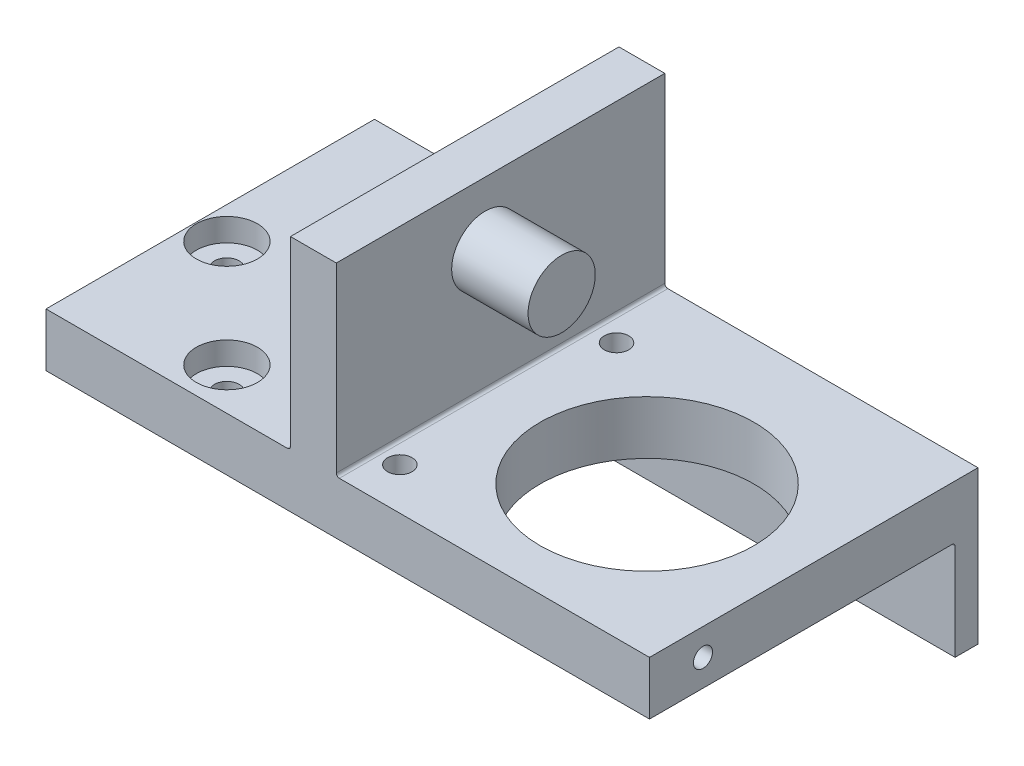
ISO-10303-21;
HEADER;
FILE_DESCRIPTION(('STEP AP214'),'2;1');
FILE_NAME('part.step','',(''),(''),'','','');
FILE_SCHEMA(('AUTOMOTIVE_DESIGN { 1 0 10303 214 1 1 1 1 }'));
ENDSEC;
DATA;
#1=APPLICATION_CONTEXT('core data for automotive mechanical design processes');
#2=APPLICATION_PROTOCOL_DEFINITION('international standard','automotive_design',2000,#1);
#3=PRODUCT_CONTEXT('',#1,'mechanical');
#4=PRODUCT('Part','Part','',(#3));
#5=PRODUCT_RELATED_PRODUCT_CATEGORY('part','',(#4));
#6=PRODUCT_DEFINITION_FORMATION('','',#4);
#7=PRODUCT_DEFINITION_CONTEXT('part definition',#1,'design');
#8=PRODUCT_DEFINITION('design','',#6,#7);
#9=PRODUCT_DEFINITION_SHAPE('','',#8);
#10=(LENGTH_UNIT() NAMED_UNIT(*) SI_UNIT(.MILLI.,.METRE.));
#11=(NAMED_UNIT(*) PLANE_ANGLE_UNIT() SI_UNIT($,.RADIAN.));
#12=(NAMED_UNIT(*) SI_UNIT($,.STERADIAN.) SOLID_ANGLE_UNIT());
#13=UNCERTAINTY_MEASURE_WITH_UNIT(LENGTH_MEASURE(1.E-05),#10,'distance_accuracy_value','');
#14=(GEOMETRIC_REPRESENTATION_CONTEXT(3) GLOBAL_UNCERTAINTY_ASSIGNED_CONTEXT((#13)) GLOBAL_UNIT_ASSIGNED_CONTEXT((#10,
#11,#12)) REPRESENTATION_CONTEXT('',''));
#15=CARTESIAN_POINT('',(0.,0.,0.));
#16=DIRECTION('',(0.,0.,1.));
#17=DIRECTION('',(1.,0.,0.));
#18=AXIS2_PLACEMENT_3D('',#15,#16,#17);
#19=CARTESIAN_POINT('',(-28.0140268456376,-7.67469519038115,16.75));
#20=DIRECTION('',(0.,1.,0.));
#21=DIRECTION('',(0.,0.,1.));
#22=AXIS2_PLACEMENT_3D('',#19,#20,#21);
#23=CYLINDRICAL_SURFACE('',#22,0.799999999999999);
#24=CARTESIAN_POINT('',(-28.0140268456376,-1.17369519038115,16.75));
#25=DIRECTION('',(0.,1.,0.));
#26=DIRECTION('',(0.,0.,1.));
#27=AXIS2_PLACEMENT_3D('',#24,#25,#26);
#28=CIRCLE('',#27,0.799999999999999);
#29=CARTESIAN_POINT('',(-28.0140268456376,-1.17369519038115,17.55));
#30=VERTEX_POINT('',#29);
#31=EDGE_CURVE('E353',#30,#30,#28,.F.);
#32=ORIENTED_EDGE('',*,*,#31,.T.);
#33=EDGE_LOOP('',(#32));
#34=FACE_BOUND('',#33,.T.);
#35=CARTESIAN_POINT('',(-28.0140268456376,0.826304809618851,16.75));
#36=DIRECTION('',(0.,1.,0.));
#37=DIRECTION('',(0.,0.,1.));
#38=AXIS2_PLACEMENT_3D('',#35,#36,#37);
#39=CIRCLE('',#38,0.799999999999999);
#40=CARTESIAN_POINT('',(-28.0140268456376,0.826304809618851,17.55));
#41=VERTEX_POINT('',#40);
#42=EDGE_CURVE('E46',#41,#41,#39,.F.);
#43=ORIENTED_EDGE('',*,*,#42,.F.);
#44=EDGE_LOOP('',(#43));
#45=FACE_BOUND('',#44,.T.);
#46=ADVANCED_FACE('F42',(#34,#45),#23,.F.);
#47=CARTESIAN_POINT('',(-28.0140268456376,-7.67469519038115,2.75));
#48=DIRECTION('',(0.,1.,0.));
#49=DIRECTION('',(0.,0.,1.));
#50=AXIS2_PLACEMENT_3D('',#47,#48,#49);
#51=CYLINDRICAL_SURFACE('',#50,0.799999999999999);
#52=CARTESIAN_POINT('',(-28.0140268456376,-1.17369519038115,2.75));
#53=DIRECTION('',(0.,1.,0.));
#54=DIRECTION('',(0.,0.,1.));
#55=AXIS2_PLACEMENT_3D('',#52,#53,#54);
#56=CIRCLE('',#55,0.799999999999999);
#57=CARTESIAN_POINT('',(-28.0140268456376,-1.17369519038115,3.55));
#58=VERTEX_POINT('',#57);
#59=EDGE_CURVE('E350',#58,#58,#56,.F.);
#60=ORIENTED_EDGE('',*,*,#59,.T.);
#61=EDGE_LOOP('',(#60));
#62=FACE_BOUND('',#61,.T.);
#63=CARTESIAN_POINT('',(-28.0140268456376,0.826304809618851,2.75));
#64=DIRECTION('',(0.,1.,0.));
#65=DIRECTION('',(0.,0.,1.));
#66=AXIS2_PLACEMENT_3D('',#63,#64,#65);
#67=CIRCLE('',#66,0.799999999999999);
#68=CARTESIAN_POINT('',(-28.0140268456376,0.826304809618851,3.55));
#69=VERTEX_POINT('',#68);
#70=EDGE_CURVE('E230',#69,#69,#67,.F.);
#71=ORIENTED_EDGE('',*,*,#70,.F.);
#72=EDGE_LOOP('',(#71));
#73=FACE_BOUND('',#72,.T.);
#74=ADVANCED_FACE('F241',(#62,#73),#51,.F.);
#75=CARTESIAN_POINT('',(-35.0140268456376,-7.67469519038115,9.75));
#76=DIRECTION('',(0.,1.,0.));
#77=DIRECTION('',(0.,0.,1.));
#78=AXIS2_PLACEMENT_3D('',#75,#76,#77);
#79=CYLINDRICAL_SURFACE('',#78,0.800000000000002);
#80=CARTESIAN_POINT('',(-35.0140268456376,-1.17369519038115,9.75));
#81=DIRECTION('',(0.,1.,0.));
#82=DIRECTION('',(0.,0.,1.));
#83=AXIS2_PLACEMENT_3D('',#80,#81,#82);
#84=CIRCLE('',#83,0.800000000000002);
#85=CARTESIAN_POINT('',(-35.0140268456376,-1.17369519038115,10.55));
#86=VERTEX_POINT('',#85);
#87=EDGE_CURVE('E347',#86,#86,#84,.F.);
#88=ORIENTED_EDGE('',*,*,#87,.T.);
#89=EDGE_LOOP('',(#88));
#90=FACE_BOUND('',#89,.T.);
#91=CARTESIAN_POINT('',(-35.0140268456376,0.826304809618851,9.75));
#92=DIRECTION('',(0.,1.,0.));
#93=DIRECTION('',(0.,0.,1.));
#94=AXIS2_PLACEMENT_3D('',#91,#92,#93);
#95=CIRCLE('',#94,0.800000000000002);
#96=CARTESIAN_POINT('',(-35.0140268456376,0.826304809618851,10.55));
#97=VERTEX_POINT('',#96);
#98=EDGE_CURVE('E228',#97,#97,#95,.F.);
#99=ORIENTED_EDGE('',*,*,#98,.F.);
#100=EDGE_LOOP('',(#99));
#101=FACE_BOUND('',#100,.T.);
#102=ADVANCED_FACE('F247',(#90,#101),#79,.F.);
#103=CARTESIAN_POINT('',(-37.1040268456376,2.32630480961885,19.5));
#104=DIRECTION('',(0.,-1.,0.));
#105=DIRECTION('',(0.,0.,-1.));
#106=AXIS2_PLACEMENT_3D('',#103,#104,#105);
#107=PLANE('',#106);
#108=CARTESIAN_POINT('',(-28.0140268456376,2.32630480961885,2.75));
#109=DIRECTION('',(0.,1.,0.));
#110=DIRECTION('',(0.,0.,1.));
#111=AXIS2_PLACEMENT_3D('',#108,#109,#110);
#112=CIRCLE('',#111,2.);
#113=CARTESIAN_POINT('',(-28.0140268456376,2.32630480961885,4.75));
#114=VERTEX_POINT('',#113);
#115=EDGE_CURVE('E607',#114,#114,#112,.T.);
#116=ORIENTED_EDGE('',*,*,#115,.F.);
#117=EDGE_LOOP('',(#116));
#118=FACE_BOUND('',#117,.T.);
#119=CARTESIAN_POINT('',(-28.0140268456376,2.32630480961885,16.75));
#120=DIRECTION('',(0.,1.,0.));
#121=DIRECTION('',(0.,0.,1.));
#122=AXIS2_PLACEMENT_3D('',#119,#120,#121);
#123=CIRCLE('',#122,2.);
#124=CARTESIAN_POINT('',(-28.0140268456376,2.32630480961885,18.75));
#125=VERTEX_POINT('',#124);
#126=EDGE_CURVE('E605',#125,#125,#123,.T.);
#127=ORIENTED_EDGE('',*,*,#126,.F.);
#128=EDGE_LOOP('',(#127));
#129=FACE_BOUND('',#128,.T.);
#130=CARTESIAN_POINT('',(-35.0140268456376,2.32630480961885,9.75));
#131=DIRECTION('',(0.,1.,0.));
#132=DIRECTION('',(0.,0.,1.));
#133=AXIS2_PLACEMENT_3D('',#130,#131,#132);
#134=CIRCLE('',#133,2.);
#135=CARTESIAN_POINT('',(-35.0140268456376,2.32630480961885,11.75));
#136=VERTEX_POINT('',#135);
#137=EDGE_CURVE('E611',#136,#136,#134,.T.);
#138=ORIENTED_EDGE('',*,*,#137,.F.);
#139=EDGE_LOOP('',(#138));
#140=FACE_BOUND('',#139,.T.);
#141=DIRECTION('',(-1.,0.,0.));
#142=VECTOR('',#141,1.);
#143=CARTESIAN_POINT('',(-37.1040268456376,2.32630480961885,19.5));
#144=LINE('',#143,#142);
#145=CARTESIAN_POINT('',(-21.3040268456376,2.32630480961885,19.5));
#146=VERTEX_POINT('',#145);
#147=CARTESIAN_POINT('',(-37.1040268456376,2.32630480961885,19.5));
#148=VERTEX_POINT('',#147);
#149=EDGE_CURVE('E193',#146,#148,#144,.T.);
#150=ORIENTED_EDGE('',*,*,#149,.F.);
#151=DIRECTION('',(0.,0.,1.));
#152=VECTOR('',#151,1.);
#153=CARTESIAN_POINT('',(-21.3040268456376,2.32630480961885,19.5));
#154=LINE('',#153,#152);
#155=CARTESIAN_POINT('',(-21.3040268456376,2.32630480961885,-2.));
#156=VERTEX_POINT('',#155);
#157=EDGE_CURVE('E217',#146,#156,#154,.F.);
#158=ORIENTED_EDGE('',*,*,#157,.T.);
#159=DIRECTION('',(1.,0.,0.));
#160=VECTOR('',#159,1.);
#161=CARTESIAN_POINT('',(-37.1040268456376,2.32630480961885,-2.));
#162=LINE('',#161,#160);
#163=CARTESIAN_POINT('',(-37.1040268456376,2.32630480961885,-2.));
#164=VERTEX_POINT('',#163);
#165=EDGE_CURVE('E174',#164,#156,#162,.T.);
#166=ORIENTED_EDGE('',*,*,#165,.F.);
#167=DIRECTION('',(0.,0.,-1.));
#168=VECTOR('',#167,1.);
#169=CARTESIAN_POINT('',(-37.1040268456376,2.32630480961885,19.5));
#170=LINE('',#169,#168);
#171=EDGE_CURVE('E196',#148,#164,#170,.T.);
#172=ORIENTED_EDGE('',*,*,#171,.F.);
#173=EDGE_LOOP('',(#150,#158,#166,#172));
#174=FACE_BOUND('',#173,.T.);
#175=ADVANCED_FACE('F279',(#118,#129,#140,#174),#107,.F.);
#176=CARTESIAN_POINT('',(-37.1040268456376,2.32630480961885,19.5));
#177=DIRECTION('',(1.,0.,0.));
#178=DIRECTION('',(0.,0.,-1.));
#179=AXIS2_PLACEMENT_3D('',#176,#177,#178);
#180=PLANE('',#179);
#181=CARTESIAN_POINT('',(-37.1040268456376,0.576304809618851,16.));
#182=DIRECTION('',(-1.,0.,0.));
#183=DIRECTION('',(0.,0.,1.));
#184=AXIS2_PLACEMENT_3D('',#181,#182,#183);
#185=CIRCLE('',#184,0.62499999999999);
#186=CARTESIAN_POINT('',(-37.1040268456376,0.576304809618851,16.625));
#187=VERTEX_POINT('',#186);
#188=EDGE_CURVE('E340',#187,#187,#185,.T.);
#189=ORIENTED_EDGE('',*,*,#188,.F.);
#190=EDGE_LOOP('',(#189));
#191=FACE_BOUND('',#190,.T.);
#192=DIRECTION('',(0.,-1.,0.));
#193=VECTOR('',#192,1.);
#194=CARTESIAN_POINT('',(-37.1040268456376,38.3294692398262,-0.5));
#195=LINE('',#194,#193);
#196=CARTESIAN_POINT('',(-37.1040268456376,-1.37369519038115,-0.5));
#197=VERTEX_POINT('',#196);
#198=CARTESIAN_POINT('',(-37.1040268456376,-7.67369519038115,-0.5));
#199=VERTEX_POINT('',#198);
#200=EDGE_CURVE('E153',#197,#199,#195,.T.);
#201=ORIENTED_EDGE('',*,*,#200,.F.);
#202=CARTESIAN_POINT('',(-37.1040268456376,-1.37369519038115,-0.300000000000002));
#203=DIRECTION('',(1.,0.,0.));
#204=DIRECTION('',(0.,0.,-1.));
#205=AXIS2_PLACEMENT_3D('',#202,#203,#204);
#206=CIRCLE('',#205,0.2);
#207=CARTESIAN_POINT('',(-37.1040268456376,-1.17369519038115,-0.300000000000002));
#208=VERTEX_POINT('',#207);
#209=EDGE_CURVE('E212',#197,#208,#206,.T.);
#210=ORIENTED_EDGE('',*,*,#209,.T.);
#211=DIRECTION('',(0.,0.,-1.));
#212=VECTOR('',#211,1.);
#213=CARTESIAN_POINT('',(-37.1040268456376,-1.17369519038115,19.5));
#214=LINE('',#213,#212);
#215=CARTESIAN_POINT('',(-37.1040268456376,-1.17369519038115,19.5));
#216=VERTEX_POINT('',#215);
#217=EDGE_CURVE('E203',#216,#208,#214,.T.);
#218=ORIENTED_EDGE('',*,*,#217,.F.);
#219=DIRECTION('',(0.,-1.,0.));
#220=VECTOR('',#219,1.);
#221=CARTESIAN_POINT('',(-37.1040268456376,2.32630480961885,19.5));
#222=LINE('',#221,#220);
#223=EDGE_CURVE('E186',#148,#216,#222,.T.);
#224=ORIENTED_EDGE('',*,*,#223,.F.);
#225=ORIENTED_EDGE('',*,*,#171,.T.);
#226=DIRECTION('',(0.,1.,0.));
#227=VECTOR('',#226,1.);
#228=CARTESIAN_POINT('',(-37.1040268456376,-7.67369519038115,-2.));
#229=LINE('',#228,#227);
#230=CARTESIAN_POINT('',(-37.1040268456376,-7.67369519038115,-2.));
#231=VERTEX_POINT('',#230);
#232=EDGE_CURVE('E168',#231,#164,#229,.T.);
#233=ORIENTED_EDGE('',*,*,#232,.F.);
#234=DIRECTION('',(0.,0.,-1.));
#235=VECTOR('',#234,1.);
#236=CARTESIAN_POINT('',(-37.1040268456376,-7.67369519038115,19.5));
#237=LINE('',#236,#235);
#238=EDGE_CURVE('E170',#199,#231,#237,.T.);
#239=ORIENTED_EDGE('',*,*,#238,.F.);
#240=EDGE_LOOP('',(#201,#210,#218,#224,#225,#233,#239));
#241=FACE_BOUND('',#240,.T.);
#242=ADVANCED_FACE('F286',(#191,#241),#180,.F.);
#243=CARTESIAN_POINT('',(-37.1040268456376,-1.17369519038115,19.5));
#244=DIRECTION('',(0.,1.,0.));
#245=DIRECTION('',(0.,0.,1.));
#246=AXIS2_PLACEMENT_3D('',#243,#244,#245);
#247=PLANE('',#246);
#248=ORIENTED_EDGE('',*,*,#87,.F.);
#249=EDGE_LOOP('',(#248));
#250=FACE_BOUND('',#249,.T.);
#251=ORIENTED_EDGE('',*,*,#59,.F.);
#252=EDGE_LOOP('',(#251));
#253=FACE_BOUND('',#252,.T.);
#254=ORIENTED_EDGE('',*,*,#31,.F.);
#255=EDGE_LOOP('',(#254));
#256=FACE_BOUND('',#255,.T.);
#257=CARTESIAN_POINT('',(-16.5140268456376,-1.17369519038115,2.75));
#258=DIRECTION('',(0.,1.,0.));
#259=DIRECTION('',(0.,0.,1.));
#260=AXIS2_PLACEMENT_3D('',#257,#258,#259);
#261=CIRCLE('',#260,0.799999999999999);
#262=CARTESIAN_POINT('',(-16.5140268456376,-1.17369519038115,3.55));
#263=VERTEX_POINT('',#262);
#264=EDGE_CURVE('E356',#263,#263,#261,.F.);
#265=ORIENTED_EDGE('',*,*,#264,.F.);
#266=EDGE_LOOP('',(#265));
#267=FACE_BOUND('',#266,.T.);
#268=CARTESIAN_POINT('',(-16.6940268456376,-1.17369519038115,16.75));
#269=DIRECTION('',(0.,1.,0.));
#270=DIRECTION('',(0.,0.,1.));
#271=AXIS2_PLACEMENT_3D('',#268,#269,#270);
#272=CIRCLE('',#271,0.799999999999999);
#273=CARTESIAN_POINT('',(-16.6940268456376,-1.17369519038115,17.55));
#274=VERTEX_POINT('',#273);
#275=EDGE_CURVE('E346',#274,#274,#272,.F.);
#276=ORIENTED_EDGE('',*,*,#275,.F.);
#277=EDGE_LOOP('',(#276));
#278=FACE_BOUND('',#277,.T.);
#279=CARTESIAN_POINT('',(-7.51402684563759,-1.17369519038115,9.75));
#280=DIRECTION('',(0.,1.,0.));
#281=DIRECTION('',(0.,0.,1.));
#282=AXIS2_PLACEMENT_3D('',#279,#280,#281);
#283=CIRCLE('',#282,7.);
#284=CARTESIAN_POINT('',(-7.51402684563759,-1.17369519038115,16.75));
#285=VERTEX_POINT('',#284);
#286=EDGE_CURVE('E183',#285,#285,#283,.F.);
#287=ORIENTED_EDGE('',*,*,#286,.F.);
#288=EDGE_LOOP('',(#287));
#289=FACE_BOUND('',#288,.T.);
#290=ORIENTED_EDGE('',*,*,#217,.T.);
#291=DIRECTION('',(1.,0.,0.));
#292=VECTOR('',#291,1.);
#293=CARTESIAN_POINT('',(2.39597315436241,-1.17369519038115,-0.300000000000002));
#294=LINE('',#293,#292);
#295=CARTESIAN_POINT('',(2.39597315436241,-1.17369519038115,-0.300000000000002));
#296=VERTEX_POINT('',#295);
#297=EDGE_CURVE('E206',#208,#296,#294,.T.);
#298=ORIENTED_EDGE('',*,*,#297,.T.);
#299=DIRECTION('',(0.,0.,-1.));
#300=VECTOR('',#299,1.);
#301=CARTESIAN_POINT('',(2.39597315436241,-1.17369519038115,19.5));
#302=LINE('',#301,#300);
#303=CARTESIAN_POINT('',(2.39597315436241,-1.17369519038115,19.5));
#304=VERTEX_POINT('',#303);
#305=EDGE_CURVE('E201',#304,#296,#302,.T.);
#306=ORIENTED_EDGE('',*,*,#305,.F.);
#307=DIRECTION('',(1.,0.,0.));
#308=VECTOR('',#307,1.);
#309=CARTESIAN_POINT('',(-37.1040268456376,-1.17369519038115,19.5));
#310=LINE('',#309,#308);
#311=EDGE_CURVE('E189',#216,#304,#310,.T.);
#312=ORIENTED_EDGE('',*,*,#311,.F.);
#313=EDGE_LOOP('',(#290,#298,#306,#312));
#314=FACE_BOUND('',#313,.T.);
#315=ADVANCED_FACE('F282',(#250,#253,#256,#267,#278,#289,#314),#247,.F.);
#316=CARTESIAN_POINT('',(2.39597315436241,2.32630480961885,19.5));
#317=DIRECTION('',(-1.,0.,0.));
#318=DIRECTION('',(0.,0.,1.));
#319=AXIS2_PLACEMENT_3D('',#316,#317,#318);
#320=PLANE('',#319);
#321=CARTESIAN_POINT('',(2.39597315436242,0.576304809618851,16.));
#322=DIRECTION('',(1.,0.,0.));
#323=DIRECTION('',(0.,0.,-1.));
#324=AXIS2_PLACEMENT_3D('',#321,#322,#323);
#325=CIRCLE('',#324,0.62499999999999);
#326=CARTESIAN_POINT('',(2.39597315436242,0.576304809618851,15.375));
#327=VERTEX_POINT('',#326);
#328=EDGE_CURVE('E334',#327,#327,#325,.T.);
#329=ORIENTED_EDGE('',*,*,#328,.F.);
#330=EDGE_LOOP('',(#329));
#331=FACE_BOUND('',#330,.T.);
#332=ORIENTED_EDGE('',*,*,#305,.T.);
#333=CARTESIAN_POINT('',(2.39597315436241,-1.37369519038115,-0.300000000000002));
#334=DIRECTION('',(-1.,0.,0.));
#335=DIRECTION('',(0.,0.,1.));
#336=AXIS2_PLACEMENT_3D('',#333,#334,#335);
#337=CIRCLE('',#336,0.2);
#338=CARTESIAN_POINT('',(2.39597315436241,-1.37369519038115,-0.5));
#339=VERTEX_POINT('',#338);
#340=EDGE_CURVE('E150',#296,#339,#337,.T.);
#341=ORIENTED_EDGE('',*,*,#340,.T.);
#342=DIRECTION('',(0.,-1.,0.));
#343=VECTOR('',#342,1.);
#344=CARTESIAN_POINT('',(2.39597315436241,38.3294692398262,-0.5));
#345=LINE('',#344,#343);
#346=CARTESIAN_POINT('',(2.39597315436241,-7.67369519038115,-0.5));
#347=VERTEX_POINT('',#346);
#348=EDGE_CURVE('E143',#339,#347,#345,.T.);
#349=ORIENTED_EDGE('',*,*,#348,.T.);
#350=DIRECTION('',(0.,0.,1.));
#351=VECTOR('',#350,1.);
#352=CARTESIAN_POINT('',(2.39597315436241,-7.67369519038115,19.5));
#353=LINE('',#352,#351);
#354=CARTESIAN_POINT('',(2.39597315436241,-7.67369519038115,-2.));
#355=VERTEX_POINT('',#354);
#356=EDGE_CURVE('E149',#355,#347,#353,.T.);
#357=ORIENTED_EDGE('',*,*,#356,.F.);
#358=DIRECTION('',(0.,1.,0.));
#359=VECTOR('',#358,1.);
#360=CARTESIAN_POINT('',(2.39597315436241,-7.67369519038115,-2.));
#361=LINE('',#360,#359);
#362=CARTESIAN_POINT('',(2.39597315436241,2.32630480961885,-2.));
#363=VERTEX_POINT('',#362);
#364=EDGE_CURVE('E166',#355,#363,#361,.T.);
#365=ORIENTED_EDGE('',*,*,#364,.T.);
#366=DIRECTION('',(0.,0.,-1.));
#367=VECTOR('',#366,1.);
#368=CARTESIAN_POINT('',(2.39597315436241,2.32630480961885,19.5));
#369=LINE('',#368,#367);
#370=CARTESIAN_POINT('',(2.39597315436241,2.32630480961885,19.5));
#371=VERTEX_POINT('',#370);
#372=EDGE_CURVE('E198',#371,#363,#369,.T.);
#373=ORIENTED_EDGE('',*,*,#372,.F.);
#374=DIRECTION('',(0.,1.,0.));
#375=VECTOR('',#374,1.);
#376=CARTESIAN_POINT('',(2.39597315436241,2.32630480961885,19.5));
#377=LINE('',#376,#375);
#378=EDGE_CURVE('E191',#304,#371,#377,.T.);
#379=ORIENTED_EDGE('',*,*,#378,.F.);
#380=EDGE_LOOP('',(#332,#341,#349,#357,#365,#373,#379));
#381=FACE_BOUND('',#380,.T.);
#382=ADVANCED_FACE('F146',(#331,#381),#320,.F.);
#383=CARTESIAN_POINT('',(-16.5140268456376,2.32630480961885,2.75));
#384=DIRECTION('',(0.,1.,0.));
#385=DIRECTION('',(0.,0.,1.));
#386=AXIS2_PLACEMENT_3D('',#383,#384,#385);
#387=CIRCLE('',#386,0.799999999999999);
#388=CARTESIAN_POINT('',(-16.5140268456376,2.32630480961885,3.55));
#389=VERTEX_POINT('',#388);
#390=EDGE_CURVE('E355',#389,#389,#387,.T.);
#391=ORIENTED_EDGE('',*,*,#390,.F.);
#392=EDGE_LOOP('',(#391));
#393=FACE_BOUND('',#392,.T.);
#394=CARTESIAN_POINT('',(-16.6940268456376,2.32630480961885,16.75));
#395=DIRECTION('',(0.,1.,0.));
#396=DIRECTION('',(0.,0.,1.));
#397=AXIS2_PLACEMENT_3D('',#394,#395,#396);
#398=CIRCLE('',#397,0.799999999999999);
#399=CARTESIAN_POINT('',(-16.6940268456376,2.32630480961885,17.55));
#400=VERTEX_POINT('',#399);
#401=EDGE_CURVE('E359',#400,#400,#398,.T.);
#402=ORIENTED_EDGE('',*,*,#401,.F.);
#403=EDGE_LOOP('',(#402));
#404=FACE_BOUND('',#403,.T.);
#405=CARTESIAN_POINT('',(-7.51402684563759,2.32630480961885,9.75));
#406=DIRECTION('',(0.,1.,0.));
#407=DIRECTION('',(0.,0.,1.));
#408=AXIS2_PLACEMENT_3D('',#405,#406,#407);
#409=CIRCLE('',#408,7.);
#410=CARTESIAN_POINT('',(-7.51402684563759,2.32630480961885,16.75));
#411=VERTEX_POINT('',#410);
#412=EDGE_CURVE('E180',#411,#411,#409,.T.);
#413=ORIENTED_EDGE('',*,*,#412,.F.);
#414=EDGE_LOOP('',(#413));
#415=FACE_BOUND('',#414,.T.);
#416=CARTESIAN_POINT('',(-17.9040268456376,2.32630480961885,-2.));
#417=VERTEX_POINT('',#416);
#418=EDGE_CURVE('E176',#417,#363,#162,.T.);
#419=ORIENTED_EDGE('',*,*,#418,.F.);
#420=DIRECTION('',(0.,0.,1.));
#421=VECTOR('',#420,1.);
#422=CARTESIAN_POINT('',(-17.9040268456376,2.32630480961885,19.5));
#423=LINE('',#422,#421);
#424=CARTESIAN_POINT('',(-17.9040268456376,2.32630480961885,19.5));
#425=VERTEX_POINT('',#424);
#426=EDGE_CURVE('E219',#417,#425,#423,.T.);
#427=ORIENTED_EDGE('',*,*,#426,.T.);
#428=EDGE_CURVE('E194',#371,#425,#144,.T.);
#429=ORIENTED_EDGE('',*,*,#428,.F.);
#430=ORIENTED_EDGE('',*,*,#372,.T.);
#431=EDGE_LOOP('',(#419,#427,#429,#430));
#432=FACE_BOUND('',#431,.T.);
#433=ADVANCED_FACE('F275',(#393,#404,#415,#432),#107,.F.);
#434=CARTESIAN_POINT('',(0.,0.,19.5));
#435=DIRECTION('',(0.,0.,1.));
#436=DIRECTION('',(1.,0.,0.));
#437=AXIS2_PLACEMENT_3D('',#434,#435,#436);
#438=PLANE('',#437);
#439=ORIENTED_EDGE('',*,*,#223,.T.);
#440=ORIENTED_EDGE('',*,*,#311,.T.);
#441=ORIENTED_EDGE('',*,*,#378,.T.);
#442=ORIENTED_EDGE('',*,*,#428,.T.);
#443=CARTESIAN_POINT('',(-17.9040268456376,2.52630480961885,19.5));
#444=DIRECTION('',(0.,0.,1.));
#445=DIRECTION('',(1.,0.,0.));
#446=AXIS2_PLACEMENT_3D('',#443,#444,#445);
#447=CIRCLE('',#446,0.2);
#448=CARTESIAN_POINT('',(-18.1040268456376,2.52630480961885,19.5));
#449=VERTEX_POINT('',#448);
#450=EDGE_CURVE('E51',#425,#449,#447,.F.);
#451=ORIENTED_EDGE('',*,*,#450,.T.);
#452=DIRECTION('',(0.,1.,0.));
#453=VECTOR('',#452,1.);
#454=CARTESIAN_POINT('',(-18.1040268456376,2.32630480961885,19.5));
#455=LINE('',#454,#453);
#456=CARTESIAN_POINT('',(-18.1040268456376,14.4295818020839,19.5));
#457=VERTEX_POINT('',#456);
#458=EDGE_CURVE('E324',#449,#457,#455,.T.);
#459=ORIENTED_EDGE('',*,*,#458,.T.);
#460=DIRECTION('',(1.,0.,0.));
#461=VECTOR('',#460,1.);
#462=CARTESIAN_POINT('',(-21.1040268456376,14.4295818020839,19.5));
#463=LINE('',#462,#461);
#464=CARTESIAN_POINT('',(-21.1040268456376,14.4295818020839,19.5));
#465=VERTEX_POINT('',#464);
#466=EDGE_CURVE('E318',#465,#457,#463,.T.);
#467=ORIENTED_EDGE('',*,*,#466,.F.);
#468=DIRECTION('',(0.,1.,0.));
#469=VECTOR('',#468,1.);
#470=CARTESIAN_POINT('',(-21.1040268456376,2.32630480961885,19.5));
#471=LINE('',#470,#469);
#472=CARTESIAN_POINT('',(-21.1040268456376,2.52630480961885,19.5));
#473=VERTEX_POINT('',#472);
#474=EDGE_CURVE('E320',#473,#465,#471,.T.);
#475=ORIENTED_EDGE('',*,*,#474,.F.);
#476=CARTESIAN_POINT('',(-21.3040268456376,2.52630480961885,19.5));
#477=DIRECTION('',(0.,0.,1.));
#478=DIRECTION('',(1.,0.,0.));
#479=AXIS2_PLACEMENT_3D('',#476,#477,#478);
#480=CIRCLE('',#479,0.2);
#481=EDGE_CURVE('E223',#473,#146,#480,.F.);
#482=ORIENTED_EDGE('',*,*,#481,.T.);
#483=ORIENTED_EDGE('',*,*,#149,.T.);
#484=EDGE_LOOP('',(#439,#440,#441,#442,#451,#459,#467,#475,#482,#483));
#485=FACE_BOUND('',#484,.T.);
#486=ADVANCED_FACE('F271',(#485),#438,.T.);
#487=CARTESIAN_POINT('',(-7.51402684563759,-1.17469519038115,9.75));
#488=DIRECTION('',(0.,1.,0.));
#489=DIRECTION('',(0.,0.,1.));
#490=AXIS2_PLACEMENT_3D('',#487,#488,#489);
#491=CYLINDRICAL_SURFACE('',#490,7.);
#492=ORIENTED_EDGE('',*,*,#412,.T.);
#493=EDGE_LOOP('',(#492));
#494=FACE_BOUND('',#493,.T.);
#495=ORIENTED_EDGE('',*,*,#286,.T.);
#496=EDGE_LOOP('',(#495));
#497=FACE_BOUND('',#496,.T.);
#498=ADVANCED_FACE('F267',(#494,#497),#491,.F.);
#499=CARTESIAN_POINT('',(-37.1040268456376,-7.67369519038115,-2.));
#500=DIRECTION('',(0.,0.,1.));
#501=DIRECTION('',(1.,0.,0.));
#502=AXIS2_PLACEMENT_3D('',#499,#500,#501);
#503=PLANE('',#502);
#504=ORIENTED_EDGE('',*,*,#165,.T.);
#505=CARTESIAN_POINT('',(-21.3040268456376,2.52630480961885,-2.));
#506=DIRECTION('',(0.,0.,1.));
#507=DIRECTION('',(1.,0.,0.));
#508=AXIS2_PLACEMENT_3D('',#505,#506,#507);
#509=CIRCLE('',#508,0.2);
#510=CARTESIAN_POINT('',(-21.1040268456376,2.52630480961885,-2.));
#511=VERTEX_POINT('',#510);
#512=EDGE_CURVE('E225',#156,#511,#509,.T.);
#513=ORIENTED_EDGE('',*,*,#512,.T.);
#514=DIRECTION('',(0.,1.,0.));
#515=VECTOR('',#514,1.);
#516=CARTESIAN_POINT('',(-21.1040268456376,2.32630480961885,-2.));
#517=LINE('',#516,#515);
#518=CARTESIAN_POINT('',(-21.1040268456376,14.4295818020839,-2.));
#519=VERTEX_POINT('',#518);
#520=EDGE_CURVE('E307',#511,#519,#517,.T.);
#521=ORIENTED_EDGE('',*,*,#520,.T.);
#522=DIRECTION('',(1.,0.,0.));
#523=VECTOR('',#522,1.);
#524=CARTESIAN_POINT('',(-21.1040268456376,14.4295818020839,-2.));
#525=LINE('',#524,#523);
#526=CARTESIAN_POINT('',(-18.1040268456376,14.4295818020839,-2.));
#527=VERTEX_POINT('',#526);
#528=EDGE_CURVE('E316',#519,#527,#525,.T.);
#529=ORIENTED_EDGE('',*,*,#528,.T.);
#530=DIRECTION('',(0.,1.,0.));
#531=VECTOR('',#530,1.);
#532=CARTESIAN_POINT('',(-18.1040268456376,2.32630480961885,-2.));
#533=LINE('',#532,#531);
#534=CARTESIAN_POINT('',(-18.1040268456376,2.52630480961885,-2.));
#535=VERTEX_POINT('',#534);
#536=EDGE_CURVE('E330',#535,#527,#533,.T.);
#537=ORIENTED_EDGE('',*,*,#536,.F.);
#538=CARTESIAN_POINT('',(-17.9040268456376,2.52630480961885,-2.));
#539=DIRECTION('',(0.,0.,1.));
#540=DIRECTION('',(1.,0.,0.));
#541=AXIS2_PLACEMENT_3D('',#538,#539,#540);
#542=CIRCLE('',#541,0.2);
#543=EDGE_CURVE('E11',#535,#417,#542,.T.);
#544=ORIENTED_EDGE('',*,*,#543,.T.);
#545=ORIENTED_EDGE('',*,*,#418,.T.);
#546=ORIENTED_EDGE('',*,*,#364,.F.);
#547=DIRECTION('',(1.,0.,0.));
#548=VECTOR('',#547,1.);
#549=CARTESIAN_POINT('',(-37.1040268456376,-7.67369519038115,-2.));
#550=LINE('',#549,#548);
#551=EDGE_CURVE('E164',#231,#355,#550,.T.);
#552=ORIENTED_EDGE('',*,*,#551,.F.);
#553=ORIENTED_EDGE('',*,*,#232,.T.);
#554=EDGE_LOOP('',(#504,#513,#521,#529,#537,#544,#545,#546,#552,#553));
#555=FACE_BOUND('',#554,.T.);
#556=ADVANCED_FACE('F264',(#555),#503,.F.);
#557=CARTESIAN_POINT('',(0.,-7.67369519038115,0.));
#558=DIRECTION('',(0.,-1.,0.));
#559=DIRECTION('',(0.,0.,-1.));
#560=AXIS2_PLACEMENT_3D('',#557,#558,#559);
#561=PLANE('',#560);
#562=DIRECTION('',(1.,0.,0.));
#563=VECTOR('',#562,1.);
#564=CARTESIAN_POINT('',(-37.1040268456376,-7.67369519038115,-0.5));
#565=LINE('',#564,#563);
#566=EDGE_CURVE('E154',#199,#347,#565,.T.);
#567=ORIENTED_EDGE('',*,*,#566,.F.);
#568=ORIENTED_EDGE('',*,*,#238,.T.);
#569=ORIENTED_EDGE('',*,*,#551,.T.);
#570=ORIENTED_EDGE('',*,*,#356,.T.);
#571=EDGE_LOOP('',(#567,#568,#569,#570));
#572=FACE_BOUND('',#571,.T.);
#573=ADVANCED_FACE('F162',(#572),#561,.T.);
#574=CARTESIAN_POINT('',(-16.6940268456376,-7.67469519038115,16.75));
#575=DIRECTION('',(0.,1.,0.));
#576=DIRECTION('',(0.,0.,1.));
#577=AXIS2_PLACEMENT_3D('',#574,#575,#576);
#578=CYLINDRICAL_SURFACE('',#577,0.799999999999999);
#579=ORIENTED_EDGE('',*,*,#401,.T.);
#580=EDGE_LOOP('',(#579));
#581=FACE_BOUND('',#580,.T.);
#582=ORIENTED_EDGE('',*,*,#275,.T.);
#583=EDGE_LOOP('',(#582));
#584=FACE_BOUND('',#583,.T.);
#585=ADVANCED_FACE('F257',(#581,#584),#578,.F.);
#586=CARTESIAN_POINT('',(-16.5140268456376,-7.67469519038115,2.75));
#587=DIRECTION('',(0.,1.,0.));
#588=DIRECTION('',(0.,0.,1.));
#589=AXIS2_PLACEMENT_3D('',#586,#587,#588);
#590=CYLINDRICAL_SURFACE('',#589,0.799999999999999);
#591=ORIENTED_EDGE('',*,*,#390,.T.);
#592=EDGE_LOOP('',(#591));
#593=FACE_BOUND('',#592,.T.);
#594=ORIENTED_EDGE('',*,*,#264,.T.);
#595=EDGE_LOOP('',(#594));
#596=FACE_BOUND('',#595,.T.);
#597=ADVANCED_FACE('F253',(#593,#596),#590,.F.);
#598=CARTESIAN_POINT('',(-32.9540268456376,0.576304809618851,16.));
#599=DIRECTION('',(-1.,0.,0.));
#600=DIRECTION('',(0.,0.,1.));
#601=AXIS2_PLACEMENT_3D('',#598,#599,#600);
#602=CONICAL_SURFACE('',#601,0.624999999999999,1.02974425867666);
#603=CARTESIAN_POINT('',(-32.5784889587454,0.57630480961885,16.));
#604=VERTEX_POINT('',#603);
#605=VERTEX_LOOP('',#604);
#606=FACE_BOUND('',#605,.T.);
#607=CARTESIAN_POINT('',(-32.9540268456376,0.576304809618851,16.));
#608=DIRECTION('',(-1.,0.,0.));
#609=DIRECTION('',(0.,0.,1.));
#610=AXIS2_PLACEMENT_3D('',#607,#608,#609);
#611=CIRCLE('',#610,0.624999999999999);
#612=CARTESIAN_POINT('',(-32.9540268456376,0.576304809618851,16.625));
#613=VERTEX_POINT('',#612);
#614=EDGE_CURVE('E343',#613,#613,#611,.T.);
#615=ORIENTED_EDGE('',*,*,#614,.T.);
#616=EDGE_LOOP('',(#615));
#617=FACE_BOUND('',#616,.T.);
#618=ADVANCED_FACE('F256',(#606,#617),#602,.F.);
#619=CARTESIAN_POINT('',(-37.1040268456376,0.576304809618851,16.));
#620=DIRECTION('',(-1.,0.,0.));
#621=DIRECTION('',(0.,0.,1.));
#622=AXIS2_PLACEMENT_3D('',#619,#620,#621);
#623=CYLINDRICAL_SURFACE('',#622,0.624999999999995);
#624=ORIENTED_EDGE('',*,*,#614,.F.);
#625=EDGE_LOOP('',(#624));
#626=FACE_BOUND('',#625,.T.);
#627=ORIENTED_EDGE('',*,*,#188,.T.);
#628=EDGE_LOOP('',(#627));
#629=FACE_BOUND('',#628,.T.);
#630=ADVANCED_FACE('F414',(#626,#629),#623,.F.);
#631=CARTESIAN_POINT('',(-1.75402684563759,0.576304809618851,16.));
#632=DIRECTION('',(1.,0.,0.));
#633=DIRECTION('',(0.,0.,-1.));
#634=AXIS2_PLACEMENT_3D('',#631,#632,#633);
#635=CONICAL_SURFACE('',#634,0.624999999999988,1.02974425867665);
#636=CARTESIAN_POINT('',(-2.12956473252981,0.57630480961885,16.));
#637=VERTEX_POINT('',#636);
#638=VERTEX_LOOP('',#637);
#639=FACE_BOUND('',#638,.T.);
#640=CARTESIAN_POINT('',(-1.75402684563759,0.576304809618851,16.));
#641=DIRECTION('',(1.,0.,0.));
#642=DIRECTION('',(0.,0.,-1.));
#643=AXIS2_PLACEMENT_3D('',#640,#641,#642);
#644=CIRCLE('',#643,0.624999999999988);
#645=CARTESIAN_POINT('',(-1.75402684563759,0.576304809618851,15.375));
#646=VERTEX_POINT('',#645);
#647=EDGE_CURVE('E337',#646,#646,#644,.T.);
#648=ORIENTED_EDGE('',*,*,#647,.T.);
#649=EDGE_LOOP('',(#648));
#650=FACE_BOUND('',#649,.T.);
#651=ADVANCED_FACE('F410',(#639,#650),#635,.F.);
#652=CARTESIAN_POINT('',(2.39597315436241,0.576304809618851,16.));
#653=DIRECTION('',(1.,0.,0.));
#654=DIRECTION('',(0.,0.,-1.));
#655=AXIS2_PLACEMENT_3D('',#652,#653,#654);
#656=CYLINDRICAL_SURFACE('',#655,0.624999999999989);
#657=ORIENTED_EDGE('',*,*,#647,.F.);
#658=EDGE_LOOP('',(#657));
#659=FACE_BOUND('',#658,.T.);
#660=ORIENTED_EDGE('',*,*,#328,.T.);
#661=EDGE_LOOP('',(#660));
#662=FACE_BOUND('',#661,.T.);
#663=ADVANCED_FACE('F407',(#659,#662),#656,.F.);
#664=CARTESIAN_POINT('',(-21.1040268456376,14.4295818020839,-2.));
#665=DIRECTION('',(0.,1.,0.));
#666=DIRECTION('',(0.,0.,1.));
#667=AXIS2_PLACEMENT_3D('',#664,#665,#666);
#668=PLANE('',#667);
#669=DIRECTION('',(0.,0.,1.));
#670=VECTOR('',#669,1.);
#671=CARTESIAN_POINT('',(-18.1040268456376,14.4295818020839,-2.));
#672=LINE('',#671,#670);
#673=EDGE_CURVE('E326',#527,#457,#672,.T.);
#674=ORIENTED_EDGE('',*,*,#673,.F.);
#675=ORIENTED_EDGE('',*,*,#528,.F.);
#676=DIRECTION('',(0.,0.,1.));
#677=VECTOR('',#676,1.);
#678=CARTESIAN_POINT('',(-21.1040268456376,14.4295818020839,-2.));
#679=LINE('',#678,#677);
#680=EDGE_CURVE('E315',#519,#465,#679,.T.);
#681=ORIENTED_EDGE('',*,*,#680,.T.);
#682=ORIENTED_EDGE('',*,*,#466,.T.);
#683=EDGE_LOOP('',(#674,#675,#681,#682));
#684=FACE_BOUND('',#683,.T.);
#685=ADVANCED_FACE('F389',(#684),#668,.T.);
#686=CARTESIAN_POINT('',(-21.1040268456376,0.,0.));
#687=DIRECTION('',(-1.,0.,0.));
#688=DIRECTION('',(0.,0.,1.));
#689=AXIS2_PLACEMENT_3D('',#686,#687,#688);
#690=PLANE('',#689);
#691=ORIENTED_EDGE('',*,*,#520,.F.);
#692=DIRECTION('',(0.,0.,1.));
#693=VECTOR('',#692,1.);
#694=CARTESIAN_POINT('',(-21.1040268456376,2.52630480961885,0.));
#695=LINE('',#694,#693);
#696=EDGE_CURVE('E214',#511,#473,#695,.T.);
#697=ORIENTED_EDGE('',*,*,#696,.T.);
#698=ORIENTED_EDGE('',*,*,#474,.T.);
#699=ORIENTED_EDGE('',*,*,#680,.F.);
#700=EDGE_LOOP('',(#691,#697,#698,#699));
#701=FACE_BOUND('',#700,.T.);
#702=ADVANCED_FACE('F312',(#701),#690,.T.);
#703=CARTESIAN_POINT('',(-18.1040268456376,0.,0.));
#704=DIRECTION('',(-1.,0.,0.));
#705=DIRECTION('',(0.,0.,1.));
#706=AXIS2_PLACEMENT_3D('',#703,#704,#705);
#707=PLANE('',#706);
#708=CARTESIAN_POINT('',(-18.1040268456376,10.2995818020839,9.75));
#709=DIRECTION('',(-1.,0.,0.));
#710=DIRECTION('',(0.,0.,1.));
#711=AXIS2_PLACEMENT_3D('',#708,#709,#710);
#712=CIRCLE('',#711,2.2);
#713=CARTESIAN_POINT('',(-18.1040268456376,10.2995818020839,11.95));
#714=VERTEX_POINT('',#713);
#715=EDGE_CURVE('E380',#714,#714,#712,.T.);
#716=ORIENTED_EDGE('',*,*,#715,.T.);
#717=EDGE_LOOP('',(#716));
#718=FACE_BOUND('',#717,.T.);
#719=ORIENTED_EDGE('',*,*,#458,.F.);
#720=DIRECTION('',(0.,0.,1.));
#721=VECTOR('',#720,1.);
#722=CARTESIAN_POINT('',(-18.1040268456376,2.52630480961885,-2.));
#723=LINE('',#722,#721);
#724=EDGE_CURVE('E65',#449,#535,#723,.F.);
#725=ORIENTED_EDGE('',*,*,#724,.T.);
#726=ORIENTED_EDGE('',*,*,#536,.T.);
#727=ORIENTED_EDGE('',*,*,#673,.T.);
#728=EDGE_LOOP('',(#719,#725,#726,#727));
#729=FACE_BOUND('',#728,.T.);
#730=ADVANCED_FACE('F391',(#718,#729),#707,.F.);
#731=CARTESIAN_POINT('',(-13.1040268456376,10.2995818020839,9.75));
#732=DIRECTION('',(-1.,0.,0.));
#733=DIRECTION('',(0.,0.,1.));
#734=AXIS2_PLACEMENT_3D('',#731,#732,#733);
#735=CYLINDRICAL_SURFACE('',#734,2.2);
#736=CARTESIAN_POINT('',(-13.1040268456376,10.2995818020839,9.75));
#737=DIRECTION('',(-1.,0.,0.));
#738=DIRECTION('',(0.,0.,1.));
#739=AXIS2_PLACEMENT_3D('',#736,#737,#738);
#740=CIRCLE('',#739,2.2);
#741=CARTESIAN_POINT('',(-13.1040268456376,10.2995818020839,11.95));
#742=VERTEX_POINT('',#741);
#743=EDGE_CURVE('E327',#742,#742,#740,.T.);
#744=ORIENTED_EDGE('',*,*,#743,.T.);
#745=EDGE_LOOP('',(#744));
#746=FACE_BOUND('',#745,.T.);
#747=ORIENTED_EDGE('',*,*,#715,.F.);
#748=EDGE_LOOP('',(#747));
#749=FACE_BOUND('',#748,.T.);
#750=ADVANCED_FACE('F393',(#746,#749),#735,.T.);
#751=CARTESIAN_POINT('',(-13.1040268456376,10.2995818020839,9.75));
#752=DIRECTION('',(-1.,0.,0.));
#753=DIRECTION('',(0.,0.,1.));
#754=AXIS2_PLACEMENT_3D('',#751,#752,#753);
#755=PLANE('',#754);
#756=ORIENTED_EDGE('',*,*,#743,.F.);
#757=EDGE_LOOP('',(#756));
#758=FACE_BOUND('',#757,.T.);
#759=ADVANCED_FACE('F400',(#758),#755,.F.);
#760=CARTESIAN_POINT('',(-37.1040268456376,38.3294692398262,-0.5));
#761=DIRECTION('',(0.,0.,-1.));
#762=DIRECTION('',(-1.,0.,0.));
#763=AXIS2_PLACEMENT_3D('',#760,#761,#762);
#764=PLANE('',#763);
#765=ORIENTED_EDGE('',*,*,#348,.F.);
#766=DIRECTION('',(1.,0.,0.));
#767=VECTOR('',#766,1.);
#768=CARTESIAN_POINT('',(-37.1040268456376,-1.37369519038115,-0.5));
#769=LINE('',#768,#767);
#770=EDGE_CURVE('E209',#339,#197,#769,.F.);
#771=ORIENTED_EDGE('',*,*,#770,.T.);
#772=ORIENTED_EDGE('',*,*,#200,.T.);
#773=ORIENTED_EDGE('',*,*,#566,.T.);
#774=EDGE_LOOP('',(#765,#771,#772,#773));
#775=FACE_BOUND('',#774,.T.);
#776=ADVANCED_FACE('F157',(#775),#764,.F.);
#777=CARTESIAN_POINT('',(-37.1040268456376,-1.37369519038115,-0.300000000000002));
#778=DIRECTION('',(-1.,0.,0.));
#779=DIRECTION('',(0.,0.,1.));
#780=AXIS2_PLACEMENT_3D('',#777,#778,#779);
#781=CYLINDRICAL_SURFACE('',#780,0.2);
#782=ORIENTED_EDGE('',*,*,#209,.F.);
#783=ORIENTED_EDGE('',*,*,#770,.F.);
#784=ORIENTED_EDGE('',*,*,#340,.F.);
#785=ORIENTED_EDGE('',*,*,#297,.F.);
#786=EDGE_LOOP('',(#782,#783,#784,#785));
#787=FACE_BOUND('',#786,.T.);
#788=ADVANCED_FACE('F291',(#787),#781,.F.);
#789=CARTESIAN_POINT('',(-21.3040268456376,2.52630480961885,0.));
#790=DIRECTION('',(0.,0.,1.));
#791=DIRECTION('',(1.,0.,0.));
#792=AXIS2_PLACEMENT_3D('',#789,#790,#791);
#793=CYLINDRICAL_SURFACE('',#792,0.2);
#794=ORIENTED_EDGE('',*,*,#512,.F.);
#795=ORIENTED_EDGE('',*,*,#157,.F.);
#796=ORIENTED_EDGE('',*,*,#481,.F.);
#797=ORIENTED_EDGE('',*,*,#696,.F.);
#798=EDGE_LOOP('',(#794,#795,#796,#797));
#799=FACE_BOUND('',#798,.T.);
#800=ADVANCED_FACE('F293',(#799),#793,.F.);
#801=CARTESIAN_POINT('',(-17.9040268456376,2.52630480961885,19.5));
#802=DIRECTION('',(0.,0.,-1.));
#803=DIRECTION('',(-1.,0.,0.));
#804=AXIS2_PLACEMENT_3D('',#801,#802,#803);
#805=CYLINDRICAL_SURFACE('',#804,0.2);
#806=ORIENTED_EDGE('',*,*,#543,.F.);
#807=ORIENTED_EDGE('',*,*,#724,.F.);
#808=ORIENTED_EDGE('',*,*,#450,.F.);
#809=ORIENTED_EDGE('',*,*,#426,.F.);
#810=EDGE_LOOP('',(#806,#807,#808,#809));
#811=FACE_BOUND('',#810,.T.);
#812=ADVANCED_FACE('F44',(#811),#805,.F.);
#813=CARTESIAN_POINT('',(-35.0140268456376,0.826304809618851,9.75));
#814=DIRECTION('',(0.,1.,0.));
#815=DIRECTION('',(0.,0.,1.));
#816=AXIS2_PLACEMENT_3D('',#813,#814,#815);
#817=PLANE('',#816);
#818=CARTESIAN_POINT('',(-35.0140268456376,0.826304809618851,9.75));
#819=DIRECTION('',(0.,1.,0.));
#820=DIRECTION('',(0.,0.,1.));
#821=AXIS2_PLACEMENT_3D('',#818,#819,#820);
#822=CIRCLE('',#821,2.);
#823=CARTESIAN_POINT('',(-35.0140268456376,0.826304809618851,11.75));
#824=VERTEX_POINT('',#823);
#825=EDGE_CURVE('E617',#824,#824,#822,.T.);
#826=ORIENTED_EDGE('',*,*,#825,.T.);
#827=EDGE_LOOP('',(#826));
#828=FACE_BOUND('',#827,.T.);
#829=ORIENTED_EDGE('',*,*,#98,.T.);
#830=EDGE_LOOP('',(#829));
#831=FACE_BOUND('',#830,.T.);
#832=ADVANCED_FACE('F300',(#828,#831),#817,.T.);
#833=CARTESIAN_POINT('',(-35.0140268456376,0.826304809618851,9.75));
#834=DIRECTION('',(0.,1.,0.));
#835=DIRECTION('',(0.,0.,1.));
#836=AXIS2_PLACEMENT_3D('',#833,#834,#835);
#837=CYLINDRICAL_SURFACE('',#836,2.);
#838=ORIENTED_EDGE('',*,*,#825,.F.);
#839=EDGE_LOOP('',(#838));
#840=FACE_BOUND('',#839,.T.);
#841=ORIENTED_EDGE('',*,*,#137,.T.);
#842=EDGE_LOOP('',(#841));
#843=FACE_BOUND('',#842,.T.);
#844=ADVANCED_FACE('F432',(#840,#843),#837,.F.);
#845=CARTESIAN_POINT('',(-28.0140268456376,0.826304809618851,2.75));
#846=DIRECTION('',(0.,1.,0.));
#847=DIRECTION('',(0.,0.,1.));
#848=AXIS2_PLACEMENT_3D('',#845,#846,#847);
#849=PLANE('',#848);
#850=CARTESIAN_POINT('',(-28.0140268456376,0.826304809618851,2.75));
#851=DIRECTION('',(0.,1.,0.));
#852=DIRECTION('',(0.,0.,1.));
#853=AXIS2_PLACEMENT_3D('',#850,#851,#852);
#854=CIRCLE('',#853,2.);
#855=CARTESIAN_POINT('',(-28.0140268456376,0.826304809618851,4.75));
#856=VERTEX_POINT('',#855);
#857=EDGE_CURVE('E231',#856,#856,#854,.T.);
#858=ORIENTED_EDGE('',*,*,#857,.T.);
#859=EDGE_LOOP('',(#858));
#860=FACE_BOUND('',#859,.T.);
#861=ORIENTED_EDGE('',*,*,#70,.T.);
#862=EDGE_LOOP('',(#861));
#863=FACE_BOUND('',#862,.T.);
#864=ADVANCED_FACE('F438',(#860,#863),#849,.T.);
#865=CARTESIAN_POINT('',(-28.0140268456376,0.826304809618851,2.75));
#866=DIRECTION('',(0.,1.,0.));
#867=DIRECTION('',(0.,0.,1.));
#868=AXIS2_PLACEMENT_3D('',#865,#866,#867);
#869=CYLINDRICAL_SURFACE('',#868,2.);
#870=ORIENTED_EDGE('',*,*,#857,.F.);
#871=EDGE_LOOP('',(#870));
#872=FACE_BOUND('',#871,.T.);
#873=ORIENTED_EDGE('',*,*,#115,.T.);
#874=EDGE_LOOP('',(#873));
#875=FACE_BOUND('',#874,.T.);
#876=ADVANCED_FACE('F557',(#872,#875),#869,.F.);
#877=CARTESIAN_POINT('',(-28.0140268456376,0.826304809618851,16.75));
#878=DIRECTION('',(0.,1.,0.));
#879=DIRECTION('',(0.,0.,1.));
#880=AXIS2_PLACEMENT_3D('',#877,#878,#879);
#881=PLANE('',#880);
#882=CARTESIAN_POINT('',(-28.0140268456376,0.826304809618851,16.75));
#883=DIRECTION('',(0.,1.,0.));
#884=DIRECTION('',(0.,0.,1.));
#885=AXIS2_PLACEMENT_3D('',#882,#883,#884);
#886=CIRCLE('',#885,2.);
#887=CARTESIAN_POINT('',(-28.0140268456376,0.826304809618851,18.75));
#888=VERTEX_POINT('',#887);
#889=EDGE_CURVE('E602',#888,#888,#886,.T.);
#890=ORIENTED_EDGE('',*,*,#889,.T.);
#891=EDGE_LOOP('',(#890));
#892=FACE_BOUND('',#891,.T.);
#893=ORIENTED_EDGE('',*,*,#42,.T.);
#894=EDGE_LOOP('',(#893));
#895=FACE_BOUND('',#894,.T.);
#896=ADVANCED_FACE('F238',(#892,#895),#881,.T.);
#897=CARTESIAN_POINT('',(-28.0140268456376,0.826304809618851,16.75));
#898=DIRECTION('',(0.,1.,0.));
#899=DIRECTION('',(0.,0.,1.));
#900=AXIS2_PLACEMENT_3D('',#897,#898,#899);
#901=CYLINDRICAL_SURFACE('',#900,2.);
#902=ORIENTED_EDGE('',*,*,#889,.F.);
#903=EDGE_LOOP('',(#902));
#904=FACE_BOUND('',#903,.T.);
#905=ORIENTED_EDGE('',*,*,#126,.T.);
#906=EDGE_LOOP('',(#905));
#907=FACE_BOUND('',#906,.T.);
#908=ADVANCED_FACE('F578',(#904,#907),#901,.F.);
#909=CLOSED_SHELL('',(#46,#74,#102,#175,#242,#315,#382,#433,#486,#498,#556,#573,#585,#597,#618,
#630,#651,#663,#685,#702,#730,#750,#759,#776,#788,#800,#812,#832,#844,#864,#876,#896,#908));
#910=MANIFOLD_SOLID_BREP('B2',#909);
#911=ADVANCED_BREP_SHAPE_REPRESENTATION('',(#18,#910),#14);
#912=SHAPE_DEFINITION_REPRESENTATION(#9,#911);
ENDSEC;
END-ISO-10303-21;
